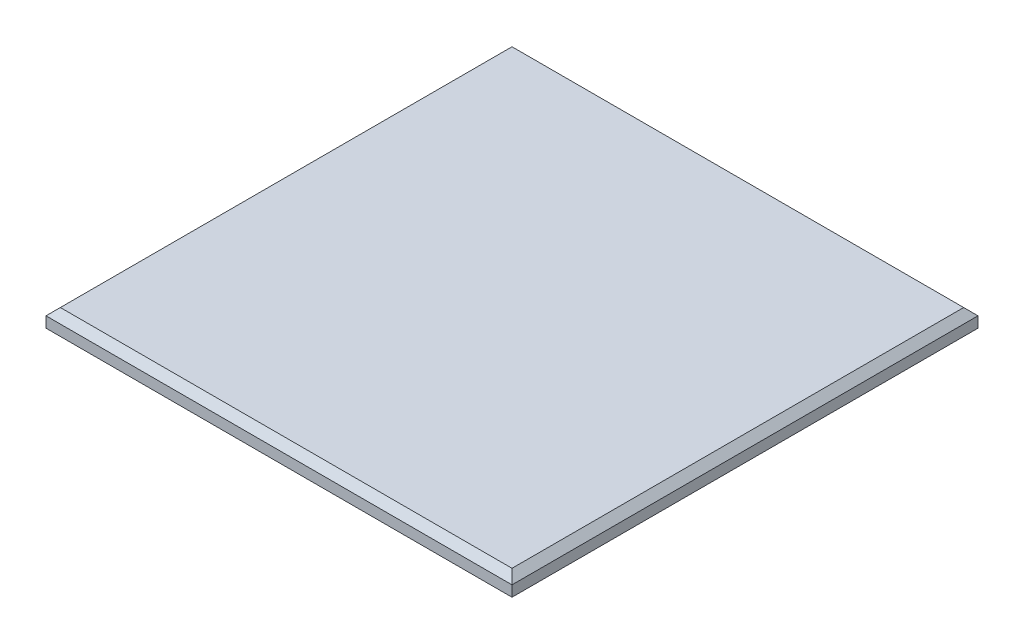
ISO-10303-21;
HEADER;
FILE_DESCRIPTION(('STEP AP214'),'2;1');
FILE_NAME('part.step','',(''),(''),'','','');
FILE_SCHEMA(('AUTOMOTIVE_DESIGN { 1 0 10303 214 1 1 1 1 }'));
ENDSEC;
DATA;
#1=APPLICATION_CONTEXT('core data for automotive mechanical design processes');
#2=APPLICATION_PROTOCOL_DEFINITION('international standard','automotive_design',2000,#1);
#3=PRODUCT_CONTEXT('',#1,'mechanical');
#4=PRODUCT('Part','Part','',(#3));
#5=PRODUCT_RELATED_PRODUCT_CATEGORY('part','',(#4));
#6=PRODUCT_DEFINITION_FORMATION('','',#4);
#7=PRODUCT_DEFINITION_CONTEXT('part definition',#1,'design');
#8=PRODUCT_DEFINITION('design','',#6,#7);
#9=PRODUCT_DEFINITION_SHAPE('','',#8);
#10=(LENGTH_UNIT() NAMED_UNIT(*) SI_UNIT(.MILLI.,.METRE.));
#11=(NAMED_UNIT(*) PLANE_ANGLE_UNIT() SI_UNIT($,.RADIAN.));
#12=(NAMED_UNIT(*) SI_UNIT($,.STERADIAN.) SOLID_ANGLE_UNIT());
#13=UNCERTAINTY_MEASURE_WITH_UNIT(LENGTH_MEASURE(1.E-05),#10,'distance_accuracy_value','');
#14=(GEOMETRIC_REPRESENTATION_CONTEXT(3) GLOBAL_UNCERTAINTY_ASSIGNED_CONTEXT((#13)) GLOBAL_UNIT_ASSIGNED_CONTEXT((#10,
#11,#12)) REPRESENTATION_CONTEXT('',''));
#15=CARTESIAN_POINT('',(0.,0.,0.));
#16=DIRECTION('',(0.,0.,1.));
#17=DIRECTION('',(1.,0.,0.));
#18=AXIS2_PLACEMENT_3D('',#15,#16,#17);
#19=CARTESIAN_POINT('',(0.,0.,0.));
#20=DIRECTION('',(0.,-1.,0.));
#21=DIRECTION('',(0.,0.,-1.));
#22=AXIS2_PLACEMENT_3D('',#19,#20,#21);
#23=PLANE('',#22);
#24=DIRECTION('',(0.,0.,1.));
#25=VECTOR('',#24,1.);
#26=CARTESIAN_POINT('',(-65.5018343347188,0.,64.8834102640032));
#27=LINE('',#26,#25);
#28=CARTESIAN_POINT('',(-65.5018343347188,0.,-65.1165897359968));
#29=VERTEX_POINT('',#28);
#30=CARTESIAN_POINT('',(-65.5018343347188,0.,64.8834102640032));
#31=VERTEX_POINT('',#30);
#32=EDGE_CURVE('E201',#29,#31,#27,.T.);
#33=ORIENTED_EDGE('',*,*,#32,.F.);
#34=DIRECTION('',(-1.,0.,0.));
#35=VECTOR('',#34,1.);
#36=CARTESIAN_POINT('',(-65.5018343347188,0.,-65.1165897359968));
#37=LINE('',#36,#35);
#38=CARTESIAN_POINT('',(64.4981656652812,0.,-65.1165897359968));
#39=VERTEX_POINT('',#38);
#40=EDGE_CURVE('E210',#39,#29,#37,.T.);
#41=ORIENTED_EDGE('',*,*,#40,.F.);
#42=DIRECTION('',(0.,0.,-1.));
#43=VECTOR('',#42,1.);
#44=CARTESIAN_POINT('',(64.4981656652812,0.,64.8834102640032));
#45=LINE('',#44,#43);
#46=CARTESIAN_POINT('',(64.4981656652812,0.,64.8834102640032));
#47=VERTEX_POINT('',#46);
#48=EDGE_CURVE('E207',#47,#39,#45,.T.);
#49=ORIENTED_EDGE('',*,*,#48,.F.);
#50=DIRECTION('',(1.,0.,0.));
#51=VECTOR('',#50,1.);
#52=CARTESIAN_POINT('',(-65.5018343347188,0.,64.8834102640032));
#53=LINE('',#52,#51);
#54=EDGE_CURVE('E204',#31,#47,#53,.T.);
#55=ORIENTED_EDGE('',*,*,#54,.F.);
#56=EDGE_LOOP('',(#33,#41,#49,#55));
#57=FACE_BOUND('',#56,.T.);
#58=DIRECTION('',(-1.,0.,0.));
#59=VECTOR('',#58,1.);
#60=CARTESIAN_POINT('',(21.235,0.,8.97255566120393));
#61=LINE('',#60,#59);
#62=CARTESIAN_POINT('',(22.235,0.,8.97255566120393));
#63=VERTEX_POINT('',#62);
#64=CARTESIAN_POINT('',(21.235,0.,8.97255566120393));
#65=VERTEX_POINT('',#64);
#66=EDGE_CURVE('E170',#63,#65,#61,.T.);
#67=ORIENTED_EDGE('',*,*,#66,.F.);
#68=DIRECTION('',(0.,0.,1.));
#69=VECTOR('',#68,1.);
#70=CARTESIAN_POINT('',(22.235,0.,-8.97255566120393));
#71=LINE('',#70,#69);
#72=CARTESIAN_POINT('',(22.235,0.,-8.97255566120393));
#73=VERTEX_POINT('',#72);
#74=EDGE_CURVE('E167',#73,#63,#71,.T.);
#75=ORIENTED_EDGE('',*,*,#74,.F.);
#76=DIRECTION('',(1.,0.,0.));
#77=VECTOR('',#76,1.);
#78=CARTESIAN_POINT('',(21.235,0.,-8.97255566120393));
#79=LINE('',#78,#77);
#80=CARTESIAN_POINT('',(21.235,0.,-8.97255566120393));
#81=VERTEX_POINT('',#80);
#82=EDGE_CURVE('E180',#81,#73,#79,.T.);
#83=ORIENTED_EDGE('',*,*,#82,.F.);
#84=DIRECTION('',(0.,0.,-1.));
#85=VECTOR('',#84,1.);
#86=CARTESIAN_POINT('',(21.235,0.,-8.97255566120393));
#87=LINE('',#86,#85);
#88=EDGE_CURVE('E188',#65,#81,#87,.T.);
#89=ORIENTED_EDGE('',*,*,#88,.F.);
#90=EDGE_LOOP('',(#67,#75,#83,#89));
#91=FACE_BOUND('',#90,.T.);
#92=DIRECTION('',(1.,0.,0.));
#93=VECTOR('',#92,1.);
#94=CARTESIAN_POINT('',(-22.235,0.,-8.97255566120393));
#95=LINE('',#94,#93);
#96=CARTESIAN_POINT('',(-22.235,0.,-8.97255566120393));
#97=VERTEX_POINT('',#96);
#98=CARTESIAN_POINT('',(-21.235,0.,-8.97255566120393));
#99=VERTEX_POINT('',#98);
#100=EDGE_CURVE('E261',#97,#99,#95,.T.);
#101=ORIENTED_EDGE('',*,*,#100,.F.);
#102=DIRECTION('',(0.,0.,-1.));
#103=VECTOR('',#102,1.);
#104=CARTESIAN_POINT('',(-22.235,0.,-8.97255566120393));
#105=LINE('',#104,#103);
#106=CARTESIAN_POINT('',(-22.235,0.,8.97255566120393));
#107=VERTEX_POINT('',#106);
#108=EDGE_CURVE('E165',#107,#97,#105,.T.);
#109=ORIENTED_EDGE('',*,*,#108,.F.);
#110=DIRECTION('',(-1.,0.,0.));
#111=VECTOR('',#110,1.);
#112=CARTESIAN_POINT('',(-22.235,0.,8.97255566120393));
#113=LINE('',#112,#111);
#114=CARTESIAN_POINT('',(-21.235,0.,8.97255566120393));
#115=VERTEX_POINT('',#114);
#116=EDGE_CURVE('E161',#115,#107,#113,.T.);
#117=ORIENTED_EDGE('',*,*,#116,.F.);
#118=DIRECTION('',(0.,0.,1.));
#119=VECTOR('',#118,1.);
#120=CARTESIAN_POINT('',(-21.235,0.,-8.97255566120393));
#121=LINE('',#120,#119);
#122=EDGE_CURVE('E263',#99,#115,#121,.T.);
#123=ORIENTED_EDGE('',*,*,#122,.F.);
#124=EDGE_LOOP('',(#101,#109,#117,#123));
#125=FACE_BOUND('',#124,.T.);
#126=ADVANCED_FACE('F39',(#57,#91,#125),#23,.T.);
#127=CARTESIAN_POINT('',(-65.5018343347188,5.,64.8834102640032));
#128=DIRECTION('',(1.,0.,0.));
#129=DIRECTION('',(0.,0.,-1.));
#130=AXIS2_PLACEMENT_3D('',#127,#128,#129);
#131=PLANE('',#130);
#132=DIRECTION('',(0.,-1.,0.));
#133=VECTOR('',#132,1.);
#134=CARTESIAN_POINT('',(-65.5018343347188,5.,64.8834102640032));
#135=LINE('',#134,#133);
#136=CARTESIAN_POINT('',(-65.5018343347188,2.99999999999997,64.8834102640032));
#137=VERTEX_POINT('',#136);
#138=EDGE_CURVE('E219',#137,#31,#135,.T.);
#139=ORIENTED_EDGE('',*,*,#138,.F.);
#140=DIRECTION('',(0.,0.,-1.));
#141=VECTOR('',#140,1.);
#142=CARTESIAN_POINT('',(-65.5018343347188,2.99999999999997,64.8834102640032));
#143=LINE('',#142,#141);
#144=CARTESIAN_POINT('',(-65.5018343347188,2.99999999999997,-65.1165897359968));
#145=VERTEX_POINT('',#144);
#146=EDGE_CURVE('E11',#137,#145,#143,.T.);
#147=ORIENTED_EDGE('',*,*,#146,.T.);
#148=DIRECTION('',(0.,-1.,0.));
#149=VECTOR('',#148,1.);
#150=CARTESIAN_POINT('',(-65.5018343347188,5.,-65.1165897359968));
#151=LINE('',#150,#149);
#152=EDGE_CURVE('E213',#145,#29,#151,.T.);
#153=ORIENTED_EDGE('',*,*,#152,.T.);
#154=ORIENTED_EDGE('',*,*,#32,.T.);
#155=EDGE_LOOP('',(#139,#147,#153,#154));
#156=FACE_BOUND('',#155,.T.);
#157=ADVANCED_FACE('F276',(#156),#131,.F.);
#158=CARTESIAN_POINT('',(-65.5018343347188,5.,64.8834102640032));
#159=DIRECTION('',(0.,0.,-1.));
#160=DIRECTION('',(-1.,0.,0.));
#161=AXIS2_PLACEMENT_3D('',#158,#159,#160);
#162=PLANE('',#161);
#163=DIRECTION('',(0.,-1.,0.));
#164=VECTOR('',#163,1.);
#165=CARTESIAN_POINT('',(64.4981656652812,5.,64.8834102640032));
#166=LINE('',#165,#164);
#167=CARTESIAN_POINT('',(64.4981656652812,2.99999999999997,64.8834102640032));
#168=VERTEX_POINT('',#167);
#169=EDGE_CURVE('E217',#168,#47,#166,.T.);
#170=ORIENTED_EDGE('',*,*,#169,.F.);
#171=DIRECTION('',(-1.,0.,0.));
#172=VECTOR('',#171,1.);
#173=CARTESIAN_POINT('',(-65.5018343347188,2.99999999999997,64.8834102640032));
#174=LINE('',#173,#172);
#175=EDGE_CURVE('E49',#168,#137,#174,.T.);
#176=ORIENTED_EDGE('',*,*,#175,.T.);
#177=ORIENTED_EDGE('',*,*,#138,.T.);
#178=ORIENTED_EDGE('',*,*,#54,.T.);
#179=EDGE_LOOP('',(#170,#176,#177,#178));
#180=FACE_BOUND('',#179,.T.);
#181=ADVANCED_FACE('F282',(#180),#162,.F.);
#182=CARTESIAN_POINT('',(64.4981656652812,5.,64.8834102640032));
#183=DIRECTION('',(-1.,0.,0.));
#184=DIRECTION('',(0.,0.,1.));
#185=AXIS2_PLACEMENT_3D('',#182,#183,#184);
#186=PLANE('',#185);
#187=DIRECTION('',(0.,-1.,0.));
#188=VECTOR('',#187,1.);
#189=CARTESIAN_POINT('',(64.4981656652812,5.,-65.1165897359968));
#190=LINE('',#189,#188);
#191=CARTESIAN_POINT('',(64.4981656652812,2.99999999999997,-65.1165897359968));
#192=VERTEX_POINT('',#191);
#193=EDGE_CURVE('E215',#192,#39,#190,.T.);
#194=ORIENTED_EDGE('',*,*,#193,.F.);
#195=DIRECTION('',(0.,0.,1.));
#196=VECTOR('',#195,1.);
#197=CARTESIAN_POINT('',(64.4981656652812,2.99999999999997,64.8834102640032));
#198=LINE('',#197,#196);
#199=EDGE_CURVE('E64',#192,#168,#198,.T.);
#200=ORIENTED_EDGE('',*,*,#199,.T.);
#201=ORIENTED_EDGE('',*,*,#169,.T.);
#202=ORIENTED_EDGE('',*,*,#48,.T.);
#203=EDGE_LOOP('',(#194,#200,#201,#202));
#204=FACE_BOUND('',#203,.T.);
#205=ADVANCED_FACE('F294',(#204),#186,.F.);
#206=CARTESIAN_POINT('',(-65.5018343347188,5.,-65.1165897359968));
#207=DIRECTION('',(0.,0.,1.));
#208=DIRECTION('',(1.,0.,0.));
#209=AXIS2_PLACEMENT_3D('',#206,#207,#208);
#210=PLANE('',#209);
#211=ORIENTED_EDGE('',*,*,#152,.F.);
#212=DIRECTION('',(1.,0.,0.));
#213=VECTOR('',#212,1.);
#214=CARTESIAN_POINT('',(-65.5018343347188,2.99999999999997,-65.1165897359968));
#215=LINE('',#214,#213);
#216=EDGE_CURVE('E234',#145,#192,#215,.T.);
#217=ORIENTED_EDGE('',*,*,#216,.T.);
#218=ORIENTED_EDGE('',*,*,#193,.T.);
#219=ORIENTED_EDGE('',*,*,#40,.T.);
#220=EDGE_LOOP('',(#211,#217,#218,#219));
#221=FACE_BOUND('',#220,.T.);
#222=ADVANCED_FACE('F291',(#221),#210,.F.);
#223=CARTESIAN_POINT('',(0.,5.,0.));
#224=DIRECTION('',(0.,-1.,0.));
#225=DIRECTION('',(0.,0.,-1.));
#226=AXIS2_PLACEMENT_3D('',#223,#224,#225);
#227=PLANE('',#226);
#228=DIRECTION('',(0.,0.,-1.));
#229=VECTOR('',#228,1.);
#230=CARTESIAN_POINT('',(62.4981656652812,5.,0.));
#231=LINE('',#230,#229);
#232=CARTESIAN_POINT('',(62.4981656652812,5.,62.8834102640032));
#233=VERTEX_POINT('',#232);
#234=CARTESIAN_POINT('',(62.4981656652812,5.,-63.1165897359968));
#235=VERTEX_POINT('',#234);
#236=EDGE_CURVE('E229',#233,#235,#231,.T.);
#237=ORIENTED_EDGE('',*,*,#236,.T.);
#238=DIRECTION('',(-1.,0.,0.));
#239=VECTOR('',#238,1.);
#240=CARTESIAN_POINT('',(0.,5.,-63.1165897359968));
#241=LINE('',#240,#239);
#242=CARTESIAN_POINT('',(-63.5018343347188,5.,-63.1165897359968));
#243=VERTEX_POINT('',#242);
#244=EDGE_CURVE('E231',#235,#243,#241,.T.);
#245=ORIENTED_EDGE('',*,*,#244,.T.);
#246=DIRECTION('',(0.,0.,1.));
#247=VECTOR('',#246,1.);
#248=CARTESIAN_POINT('',(-63.5018343347188,5.,0.));
#249=LINE('',#248,#247);
#250=CARTESIAN_POINT('',(-63.5018343347188,5.,62.8834102640032));
#251=VERTEX_POINT('',#250);
#252=EDGE_CURVE('E221',#243,#251,#249,.T.);
#253=ORIENTED_EDGE('',*,*,#252,.T.);
#254=DIRECTION('',(1.,0.,0.));
#255=VECTOR('',#254,1.);
#256=CARTESIAN_POINT('',(0.,5.,62.8834102640032));
#257=LINE('',#256,#255);
#258=EDGE_CURVE('E227',#251,#233,#257,.T.);
#259=ORIENTED_EDGE('',*,*,#258,.T.);
#260=EDGE_LOOP('',(#237,#245,#253,#259));
#261=FACE_BOUND('',#260,.T.);
#262=ADVANCED_FACE('F289',(#261),#227,.F.);
#263=CARTESIAN_POINT('',(22.235,-8.,-8.97255566120393));
#264=DIRECTION('',(-1.,0.,0.));
#265=DIRECTION('',(0.,0.,1.));
#266=AXIS2_PLACEMENT_3D('',#263,#264,#265);
#267=PLANE('',#266);
#268=ORIENTED_EDGE('',*,*,#74,.T.);
#269=DIRECTION('',(0.,1.,0.));
#270=VECTOR('',#269,1.);
#271=CARTESIAN_POINT('',(22.235,-8.,8.97255566120393));
#272=LINE('',#271,#270);
#273=CARTESIAN_POINT('',(22.235,-8.,8.97255566120393));
#274=VERTEX_POINT('',#273);
#275=EDGE_CURVE('E199',#274,#63,#272,.T.);
#276=ORIENTED_EDGE('',*,*,#275,.F.);
#277=DIRECTION('',(0.,0.,1.));
#278=VECTOR('',#277,1.);
#279=CARTESIAN_POINT('',(22.235,-8.,-8.97255566120393));
#280=LINE('',#279,#278);
#281=CARTESIAN_POINT('',(22.235,-8.,-8.97255566120393));
#282=VERTEX_POINT('',#281);
#283=EDGE_CURVE('E176',#282,#274,#280,.T.);
#284=ORIENTED_EDGE('',*,*,#283,.F.);
#285=DIRECTION('',(0.,1.,0.));
#286=VECTOR('',#285,1.);
#287=CARTESIAN_POINT('',(22.235,-8.,-8.97255566120393));
#288=LINE('',#287,#286);
#289=EDGE_CURVE('E185',#282,#73,#288,.T.);
#290=ORIENTED_EDGE('',*,*,#289,.T.);
#291=EDGE_LOOP('',(#268,#276,#284,#290));
#292=FACE_BOUND('',#291,.T.);
#293=ADVANCED_FACE('F337',(#292),#267,.F.);
#294=CARTESIAN_POINT('',(21.235,-8.,8.97255566120393));
#295=DIRECTION('',(0.,0.,-1.));
#296=DIRECTION('',(-1.,0.,0.));
#297=AXIS2_PLACEMENT_3D('',#294,#295,#296);
#298=PLANE('',#297);
#299=ORIENTED_EDGE('',*,*,#66,.T.);
#300=DIRECTION('',(0.,1.,0.));
#301=VECTOR('',#300,1.);
#302=CARTESIAN_POINT('',(21.235,-8.,8.97255566120393));
#303=LINE('',#302,#301);
#304=CARTESIAN_POINT('',(21.235,-8.,8.97255566120393));
#305=VERTEX_POINT('',#304);
#306=EDGE_CURVE('E196',#305,#65,#303,.T.);
#307=ORIENTED_EDGE('',*,*,#306,.F.);
#308=DIRECTION('',(-1.,0.,0.));
#309=VECTOR('',#308,1.);
#310=CARTESIAN_POINT('',(21.235,-8.,8.97255566120393));
#311=LINE('',#310,#309);
#312=EDGE_CURVE('E179',#274,#305,#311,.T.);
#313=ORIENTED_EDGE('',*,*,#312,.F.);
#314=ORIENTED_EDGE('',*,*,#275,.T.);
#315=EDGE_LOOP('',(#299,#307,#313,#314));
#316=FACE_BOUND('',#315,.T.);
#317=ADVANCED_FACE('F341',(#316),#298,.F.);
#318=CARTESIAN_POINT('',(21.235,-8.,-8.97255566120393));
#319=DIRECTION('',(1.,0.,0.));
#320=DIRECTION('',(0.,0.,-1.));
#321=AXIS2_PLACEMENT_3D('',#318,#319,#320);
#322=PLANE('',#321);
#323=ORIENTED_EDGE('',*,*,#88,.T.);
#324=DIRECTION('',(0.,1.,0.));
#325=VECTOR('',#324,1.);
#326=CARTESIAN_POINT('',(21.235,-8.,-8.97255566120393));
#327=LINE('',#326,#325);
#328=CARTESIAN_POINT('',(21.235,-8.,-8.97255566120393));
#329=VERTEX_POINT('',#328);
#330=EDGE_CURVE('E194',#329,#81,#327,.T.);
#331=ORIENTED_EDGE('',*,*,#330,.F.);
#332=DIRECTION('',(0.,0.,-1.));
#333=VECTOR('',#332,1.);
#334=CARTESIAN_POINT('',(21.235,-8.,-8.97255566120393));
#335=LINE('',#334,#333);
#336=EDGE_CURVE('E182',#305,#329,#335,.T.);
#337=ORIENTED_EDGE('',*,*,#336,.F.);
#338=ORIENTED_EDGE('',*,*,#306,.T.);
#339=EDGE_LOOP('',(#323,#331,#337,#338));
#340=FACE_BOUND('',#339,.T.);
#341=ADVANCED_FACE('F346',(#340),#322,.F.);
#342=CARTESIAN_POINT('',(21.235,-8.,-8.97255566120393));
#343=DIRECTION('',(0.,0.,1.));
#344=DIRECTION('',(1.,0.,0.));
#345=AXIS2_PLACEMENT_3D('',#342,#343,#344);
#346=PLANE('',#345);
#347=ORIENTED_EDGE('',*,*,#82,.T.);
#348=ORIENTED_EDGE('',*,*,#289,.F.);
#349=DIRECTION('',(1.,0.,0.));
#350=VECTOR('',#349,1.);
#351=CARTESIAN_POINT('',(21.235,-8.,-8.97255566120393));
#352=LINE('',#351,#350);
#353=EDGE_CURVE('E184',#329,#282,#352,.T.);
#354=ORIENTED_EDGE('',*,*,#353,.F.);
#355=ORIENTED_EDGE('',*,*,#330,.T.);
#356=EDGE_LOOP('',(#347,#348,#354,#355));
#357=FACE_BOUND('',#356,.T.);
#358=ADVANCED_FACE('F352',(#357),#346,.F.);
#359=CARTESIAN_POINT('',(0.,-8.,0.));
#360=DIRECTION('',(0.,1.,0.));
#361=DIRECTION('',(0.,0.,1.));
#362=AXIS2_PLACEMENT_3D('',#359,#360,#361);
#363=PLANE('',#362);
#364=ORIENTED_EDGE('',*,*,#283,.T.);
#365=ORIENTED_EDGE('',*,*,#312,.T.);
#366=ORIENTED_EDGE('',*,*,#336,.T.);
#367=ORIENTED_EDGE('',*,*,#353,.T.);
#368=EDGE_LOOP('',(#364,#365,#366,#367));
#369=FACE_BOUND('',#368,.T.);
#370=ADVANCED_FACE('F356',(#369),#363,.F.);
#371=CARTESIAN_POINT('',(-22.235,-8.,-8.97255566120393));
#372=DIRECTION('',(1.,0.,0.));
#373=DIRECTION('',(0.,0.,-1.));
#374=AXIS2_PLACEMENT_3D('',#371,#372,#373);
#375=PLANE('',#374);
#376=ORIENTED_EDGE('',*,*,#108,.T.);
#377=DIRECTION('',(0.,1.,0.));
#378=VECTOR('',#377,1.);
#379=CARTESIAN_POINT('',(-22.235,-8.,-8.97255566120393));
#380=LINE('',#379,#378);
#381=CARTESIAN_POINT('',(-22.235,-8.,-8.97255566120393));
#382=VERTEX_POINT('',#381);
#383=EDGE_CURVE('E145',#382,#97,#380,.T.);
#384=ORIENTED_EDGE('',*,*,#383,.F.);
#385=DIRECTION('',(0.,0.,-1.));
#386=VECTOR('',#385,1.);
#387=CARTESIAN_POINT('',(-22.235,-8.,-8.97255566120393));
#388=LINE('',#387,#386);
#389=CARTESIAN_POINT('',(-22.235,-8.,8.97255566120393));
#390=VERTEX_POINT('',#389);
#391=EDGE_CURVE('E152',#390,#382,#388,.T.);
#392=ORIENTED_EDGE('',*,*,#391,.F.);
#393=DIRECTION('',(0.,1.,0.));
#394=VECTOR('',#393,1.);
#395=CARTESIAN_POINT('',(-22.235,-8.,8.97255566120393));
#396=LINE('',#395,#394);
#397=EDGE_CURVE('E259',#390,#107,#396,.T.);
#398=ORIENTED_EDGE('',*,*,#397,.T.);
#399=EDGE_LOOP('',(#376,#384,#392,#398));
#400=FACE_BOUND('',#399,.T.);
#401=ADVANCED_FACE('F163',(#400),#375,.F.);
#402=CARTESIAN_POINT('',(-22.235,-8.,-8.97255566120393));
#403=DIRECTION('',(0.,0.,1.));
#404=DIRECTION('',(1.,0.,0.));
#405=AXIS2_PLACEMENT_3D('',#402,#403,#404);
#406=PLANE('',#405);
#407=ORIENTED_EDGE('',*,*,#100,.T.);
#408=DIRECTION('',(0.,1.,0.));
#409=VECTOR('',#408,1.);
#410=CARTESIAN_POINT('',(-21.235,-8.,-8.97255566120393));
#411=LINE('',#410,#409);
#412=CARTESIAN_POINT('',(-21.235,-8.,-8.97255566120393));
#413=VERTEX_POINT('',#412);
#414=EDGE_CURVE('E148',#413,#99,#411,.T.);
#415=ORIENTED_EDGE('',*,*,#414,.F.);
#416=DIRECTION('',(1.,0.,0.));
#417=VECTOR('',#416,1.);
#418=CARTESIAN_POINT('',(-22.235,-8.,-8.97255566120393));
#419=LINE('',#418,#417);
#420=EDGE_CURVE('E141',#382,#413,#419,.T.);
#421=ORIENTED_EDGE('',*,*,#420,.F.);
#422=ORIENTED_EDGE('',*,*,#383,.T.);
#423=EDGE_LOOP('',(#407,#415,#421,#422));
#424=FACE_BOUND('',#423,.T.);
#425=ADVANCED_FACE('F143',(#424),#406,.F.);
#426=CARTESIAN_POINT('',(-21.235,-8.,-8.97255566120393));
#427=DIRECTION('',(-1.,0.,0.));
#428=DIRECTION('',(0.,0.,1.));
#429=AXIS2_PLACEMENT_3D('',#426,#427,#428);
#430=PLANE('',#429);
#431=CARTESIAN_POINT('',(-21.235,-3.78437053833864,0.));
#432=DIRECTION('',(-1.,0.,0.));
#433=DIRECTION('',(0.,0.,1.));
#434=AXIS2_PLACEMENT_3D('',#431,#432,#433);
#435=CIRCLE('',#434,2.5);
#436=CARTESIAN_POINT('',(-21.235,-3.78437053833864,2.5));
#437=VERTEX_POINT('',#436);
#438=EDGE_CURVE('E222',#437,#437,#435,.T.);
#439=ORIENTED_EDGE('',*,*,#438,.T.);
#440=EDGE_LOOP('',(#439));
#441=FACE_BOUND('',#440,.T.);
#442=ORIENTED_EDGE('',*,*,#122,.T.);
#443=DIRECTION('',(0.,1.,0.));
#444=VECTOR('',#443,1.);
#445=CARTESIAN_POINT('',(-21.235,-8.,8.97255566120393));
#446=LINE('',#445,#444);
#447=CARTESIAN_POINT('',(-21.235,-8.,8.97255566120393));
#448=VERTEX_POINT('',#447);
#449=EDGE_CURVE('E172',#448,#115,#446,.T.);
#450=ORIENTED_EDGE('',*,*,#449,.F.);
#451=DIRECTION('',(0.,0.,1.));
#452=VECTOR('',#451,1.);
#453=CARTESIAN_POINT('',(-21.235,-8.,-8.97255566120393));
#454=LINE('',#453,#452);
#455=EDGE_CURVE('E151',#413,#448,#454,.T.);
#456=ORIENTED_EDGE('',*,*,#455,.F.);
#457=ORIENTED_EDGE('',*,*,#414,.T.);
#458=EDGE_LOOP('',(#442,#450,#456,#457));
#459=FACE_BOUND('',#458,.T.);
#460=ADVANCED_FACE('F273',(#441,#459),#430,.F.);
#461=CARTESIAN_POINT('',(-22.235,-8.,8.97255566120393));
#462=DIRECTION('',(0.,0.,-1.));
#463=DIRECTION('',(-1.,0.,0.));
#464=AXIS2_PLACEMENT_3D('',#461,#462,#463);
#465=PLANE('',#464);
#466=ORIENTED_EDGE('',*,*,#116,.T.);
#467=ORIENTED_EDGE('',*,*,#397,.F.);
#468=DIRECTION('',(-1.,0.,0.));
#469=VECTOR('',#468,1.);
#470=CARTESIAN_POINT('',(-22.235,-8.,8.97255566120393));
#471=LINE('',#470,#469);
#472=EDGE_CURVE('E157',#448,#390,#471,.T.);
#473=ORIENTED_EDGE('',*,*,#472,.F.);
#474=ORIENTED_EDGE('',*,*,#449,.T.);
#475=EDGE_LOOP('',(#466,#467,#473,#474));
#476=FACE_BOUND('',#475,.T.);
#477=ADVANCED_FACE('F269',(#476),#465,.F.);
#478=CARTESIAN_POINT('',(0.,-8.,0.));
#479=DIRECTION('',(0.,1.,0.));
#480=DIRECTION('',(0.,0.,1.));
#481=AXIS2_PLACEMENT_3D('',#478,#479,#480);
#482=PLANE('',#481);
#483=ORIENTED_EDGE('',*,*,#391,.T.);
#484=ORIENTED_EDGE('',*,*,#420,.T.);
#485=ORIENTED_EDGE('',*,*,#455,.T.);
#486=ORIENTED_EDGE('',*,*,#472,.T.);
#487=EDGE_LOOP('',(#483,#484,#485,#486));
#488=FACE_BOUND('',#487,.T.);
#489=ADVANCED_FACE('F155',(#488),#482,.F.);
#490=CARTESIAN_POINT('',(20.765,-3.78437053833864,0.));
#491=DIRECTION('',(-1.,0.,0.));
#492=DIRECTION('',(0.,0.,1.));
#493=AXIS2_PLACEMENT_3D('',#490,#491,#492);
#494=CYLINDRICAL_SURFACE('',#493,2.5);
#495=CARTESIAN_POINT('',(20.765,-3.78437053833864,0.));
#496=DIRECTION('',(-1.,0.,0.));
#497=DIRECTION('',(0.,0.,1.));
#498=AXIS2_PLACEMENT_3D('',#495,#496,#497);
#499=CIRCLE('',#498,2.5);
#500=CARTESIAN_POINT('',(20.765,-3.78437053833864,2.5));
#501=VERTEX_POINT('',#500);
#502=EDGE_CURVE('E225',#501,#501,#499,.T.);
#503=ORIENTED_EDGE('',*,*,#502,.T.);
#504=EDGE_LOOP('',(#503));
#505=FACE_BOUND('',#504,.T.);
#506=ORIENTED_EDGE('',*,*,#438,.F.);
#507=EDGE_LOOP('',(#506));
#508=FACE_BOUND('',#507,.T.);
#509=ADVANCED_FACE('F325',(#505,#508),#494,.T.);
#510=CARTESIAN_POINT('',(20.765,-3.78437053833864,0.));
#511=DIRECTION('',(-1.,0.,0.));
#512=DIRECTION('',(0.,0.,1.));
#513=AXIS2_PLACEMENT_3D('',#510,#511,#512);
#514=PLANE('',#513);
#515=ORIENTED_EDGE('',*,*,#502,.F.);
#516=EDGE_LOOP('',(#515));
#517=FACE_BOUND('',#516,.T.);
#518=ADVANCED_FACE('F320',(#517),#514,.F.);
#519=CARTESIAN_POINT('',(0.,5.,62.8834102640032));
#520=DIRECTION('',(0.,-0.707106781186547,-0.707106781186547));
#521=DIRECTION('',(1.,0.,0.));
#522=AXIS2_PLACEMENT_3D('',#519,#520,#521);
#523=PLANE('',#522);
#524=DIRECTION('',(0.577350269189626,0.577350269189626,-0.577350269189626));
#525=VECTOR('',#524,1.);
#526=CARTESIAN_POINT('',(-42.5406975800511,25.9611367546677,41.9222735093354));
#527=LINE('',#526,#525);
#528=EDGE_CURVE('E242',#137,#251,#527,.T.);
#529=ORIENTED_EDGE('',*,*,#528,.F.);
#530=ORIENTED_EDGE('',*,*,#175,.F.);
#531=DIRECTION('',(-0.577350269189626,0.577350269189626,-0.577350269189626));
#532=VECTOR('',#531,1.);
#533=CARTESIAN_POINT('',(41.6654437768541,25.8327218884271,42.0506883755761));
#534=LINE('',#533,#532);
#535=EDGE_CURVE('E44',#233,#168,#534,.F.);
#536=ORIENTED_EDGE('',*,*,#535,.F.);
#537=ORIENTED_EDGE('',*,*,#258,.F.);
#538=EDGE_LOOP('',(#529,#530,#536,#537));
#539=FACE_BOUND('',#538,.T.);
#540=ADVANCED_FACE('F42',(#539),#523,.F.);
#541=CARTESIAN_POINT('',(62.4981656652812,5.,0.));
#542=DIRECTION('',(-0.707106781186547,-0.707106781186547,0.));
#543=DIRECTION('',(0.,0.,-1.));
#544=AXIS2_PLACEMENT_3D('',#541,#542,#543);
#545=PLANE('',#544);
#546=ORIENTED_EDGE('',*,*,#535,.T.);
#547=ORIENTED_EDGE('',*,*,#199,.F.);
#548=DIRECTION('',(-0.577350269189626,0.577350269189626,0.577350269189626));
#549=VECTOR('',#548,1.);
#550=CARTESIAN_POINT('',(41.4593024199489,26.0388632453323,-42.0777264906645));
#551=LINE('',#550,#549);
#552=EDGE_CURVE('E241',#235,#192,#551,.F.);
#553=ORIENTED_EDGE('',*,*,#552,.F.);
#554=ORIENTED_EDGE('',*,*,#236,.F.);
#555=EDGE_LOOP('',(#546,#547,#553,#554));
#556=FACE_BOUND('',#555,.T.);
#557=ADVANCED_FACE('F313',(#556),#545,.F.);
#558=CARTESIAN_POINT('',(-63.5018343347188,5.,0.));
#559=DIRECTION('',(0.707106781186547,-0.707106781186547,0.));
#560=DIRECTION('',(0.,0.,1.));
#561=AXIS2_PLACEMENT_3D('',#558,#559,#560);
#562=PLANE('',#561);
#563=ORIENTED_EDGE('',*,*,#528,.T.);
#564=ORIENTED_EDGE('',*,*,#252,.F.);
#565=DIRECTION('',(-0.577350269189626,-0.577350269189626,-0.577350269189626));
#566=VECTOR('',#565,1.);
#567=CARTESIAN_POINT('',(-42.4629710893865,26.0388632453323,-42.0777264906645));
#568=LINE('',#567,#566);
#569=EDGE_CURVE('E239',#145,#243,#568,.F.);
#570=ORIENTED_EDGE('',*,*,#569,.F.);
#571=ORIENTED_EDGE('',*,*,#146,.F.);
#572=EDGE_LOOP('',(#563,#564,#570,#571));
#573=FACE_BOUND('',#572,.T.);
#574=ADVANCED_FACE('F307',(#573),#562,.F.);
#575=CARTESIAN_POINT('',(0.,5.,-63.1165897359968));
#576=DIRECTION('',(0.,-0.707106781186547,0.707106781186547));
#577=DIRECTION('',(-1.,0.,0.));
#578=AXIS2_PLACEMENT_3D('',#575,#576,#577);
#579=PLANE('',#578);
#580=ORIENTED_EDGE('',*,*,#552,.T.);
#581=ORIENTED_EDGE('',*,*,#216,.F.);
#582=ORIENTED_EDGE('',*,*,#569,.T.);
#583=ORIENTED_EDGE('',*,*,#244,.F.);
#584=EDGE_LOOP('',(#580,#581,#582,#583));
#585=FACE_BOUND('',#584,.T.);
#586=ADVANCED_FACE('F301',(#585),#579,.F.);
#587=CLOSED_SHELL('',(#126,#157,#181,#205,#222,#262,#293,#317,#341,#358,#370,#401,#425,#460,
#477,#489,#509,#518,#540,#557,#574,#586));
#588=MANIFOLD_SOLID_BREP('B2',#587);
#589=ADVANCED_BREP_SHAPE_REPRESENTATION('',(#18,#588),#14);
#590=SHAPE_DEFINITION_REPRESENTATION(#9,#589);
ENDSEC;
END-ISO-10303-21;
